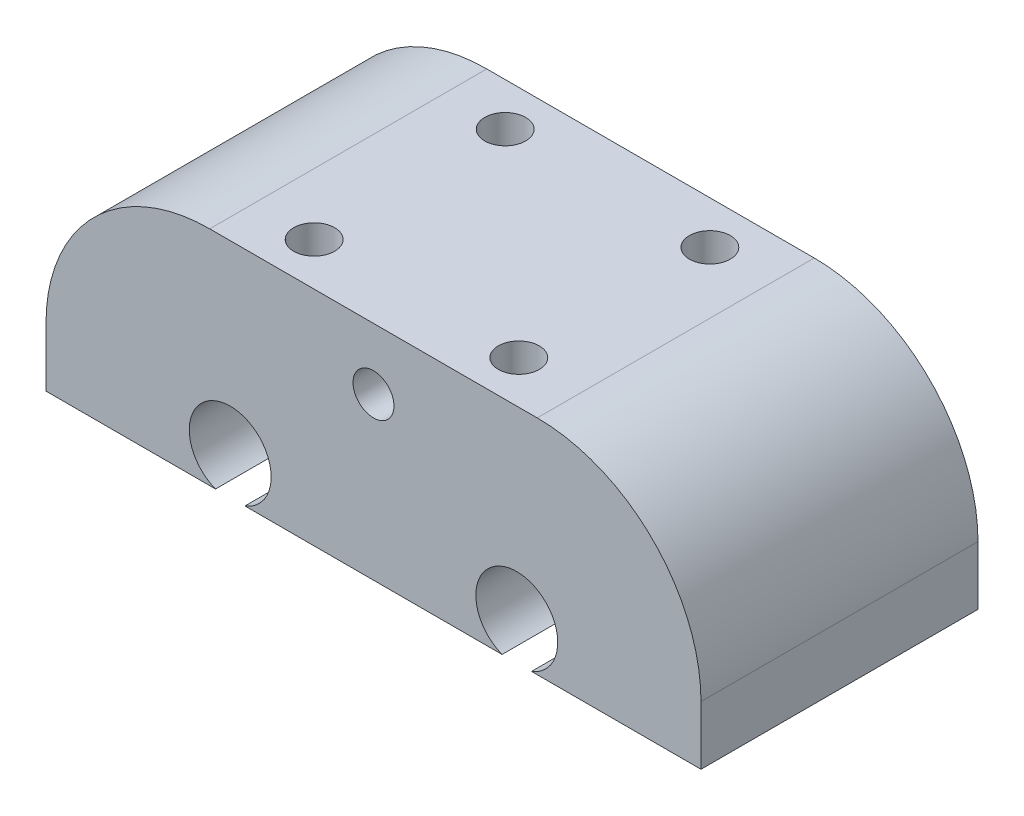
ISO-10303-21;
HEADER;
FILE_DESCRIPTION(('STEP AP214'),'2;1');
FILE_NAME('part.step','',(''),(''),'','','');
FILE_SCHEMA(('AUTOMOTIVE_DESIGN { 1 0 10303 214 1 1 1 1 }'));
ENDSEC;
DATA;
#1=APPLICATION_CONTEXT('core data for automotive mechanical design processes');
#2=APPLICATION_PROTOCOL_DEFINITION('international standard','automotive_design',2000,#1);
#3=PRODUCT_CONTEXT('',#1,'mechanical');
#4=PRODUCT('Part','Part','',(#3));
#5=PRODUCT_RELATED_PRODUCT_CATEGORY('part','',(#4));
#6=PRODUCT_DEFINITION_FORMATION('','',#4);
#7=PRODUCT_DEFINITION_CONTEXT('part definition',#1,'design');
#8=PRODUCT_DEFINITION('design','',#6,#7);
#9=PRODUCT_DEFINITION_SHAPE('','',#8);
#10=(LENGTH_UNIT() NAMED_UNIT(*) SI_UNIT(.MILLI.,.METRE.));
#11=(NAMED_UNIT(*) PLANE_ANGLE_UNIT() SI_UNIT($,.RADIAN.));
#12=(NAMED_UNIT(*) SI_UNIT($,.STERADIAN.) SOLID_ANGLE_UNIT());
#13=UNCERTAINTY_MEASURE_WITH_UNIT(LENGTH_MEASURE(1.E-05),#10,'distance_accuracy_value','');
#14=(GEOMETRIC_REPRESENTATION_CONTEXT(3) GLOBAL_UNCERTAINTY_ASSIGNED_CONTEXT((#13)) GLOBAL_UNIT_ASSIGNED_CONTEXT((#10,
#11,#12)) REPRESENTATION_CONTEXT('',''));
#15=CARTESIAN_POINT('',(0.,0.,0.));
#16=DIRECTION('',(0.,0.,1.));
#17=DIRECTION('',(1.,0.,0.));
#18=AXIS2_PLACEMENT_3D('',#15,#16,#17);
#19=CARTESIAN_POINT('',(0.,0.,0.));
#20=DIRECTION('',(0.,1.,0.));
#21=DIRECTION('',(0.,0.,1.));
#22=AXIS2_PLACEMENT_3D('',#19,#20,#21);
#23=PLANE('',#22);
#24=DIRECTION('',(1.,0.,0.));
#25=VECTOR('',#24,1.);
#26=CARTESIAN_POINT('',(0.,0.,6.8));
#27=LINE('',#26,#25);
#28=CARTESIAN_POINT('',(24.5,0.,6.8));
#29=VERTEX_POINT('',#28);
#30=CARTESIAN_POINT('',(33.4229670385731,0.,6.8));
#31=VERTEX_POINT('',#30);
#32=EDGE_CURVE('E228',#29,#31,#27,.T.);
#33=ORIENTED_EDGE('',*,*,#32,.F.);
#34=DIRECTION('',(0.,0.,1.));
#35=VECTOR('',#34,1.);
#36=CARTESIAN_POINT('',(24.5,0.,0.));
#37=LINE('',#36,#35);
#38=CARTESIAN_POINT('',(24.5,0.,13.8));
#39=VERTEX_POINT('',#38);
#40=EDGE_CURVE('E200',#29,#39,#37,.T.);
#41=ORIENTED_EDGE('',*,*,#40,.T.);
#42=DIRECTION('',(1.,0.,0.));
#43=VECTOR('',#42,1.);
#44=CARTESIAN_POINT('',(0.,0.,13.8));
#45=LINE('',#44,#43);
#46=CARTESIAN_POINT('',(33.4229670385731,0.,13.8));
#47=VERTEX_POINT('',#46);
#48=EDGE_CURVE('E223',#39,#47,#45,.T.);
#49=ORIENTED_EDGE('',*,*,#48,.T.);
#50=DIRECTION('',(0.,0.,1.));
#51=VECTOR('',#50,1.);
#52=CARTESIAN_POINT('',(33.4229670385731,0.,0.));
#53=LINE('',#52,#51);
#54=CARTESIAN_POINT('',(33.4229670385731,0.,20.3));
#55=VERTEX_POINT('',#54);
#56=EDGE_CURVE('E315',#47,#55,#53,.T.);
#57=ORIENTED_EDGE('',*,*,#56,.T.);
#58=DIRECTION('',(1.,0.,0.));
#59=VECTOR('',#58,1.);
#60=CARTESIAN_POINT('',(0.,0.,20.3));
#61=LINE('',#60,#59);
#62=CARTESIAN_POINT('',(14.5770329614269,0.,20.3));
#63=VERTEX_POINT('',#62);
#64=EDGE_CURVE('E289',#63,#55,#61,.T.);
#65=ORIENTED_EDGE('',*,*,#64,.F.);
#66=DIRECTION('',(0.,0.,1.));
#67=VECTOR('',#66,1.);
#68=CARTESIAN_POINT('',(14.5770329614269,0.,0.));
#69=LINE('',#68,#67);
#70=CARTESIAN_POINT('',(14.5770329614269,0.,13.8));
#71=VERTEX_POINT('',#70);
#72=EDGE_CURVE('E304',#63,#71,#69,.F.);
#73=ORIENTED_EDGE('',*,*,#72,.T.);
#74=DIRECTION('',(1.,0.,0.));
#75=VECTOR('',#74,1.);
#76=CARTESIAN_POINT('',(0.,0.,13.8));
#77=LINE('',#76,#75);
#78=CARTESIAN_POINT('',(23.4955030352237,0.,13.8));
#79=VERTEX_POINT('',#78);
#80=EDGE_CURVE('E254',#71,#79,#77,.T.);
#81=ORIENTED_EDGE('',*,*,#80,.T.);
#82=DIRECTION('',(0.,0.,-1.));
#83=VECTOR('',#82,1.);
#84=CARTESIAN_POINT('',(23.4955030352237,0.,0.));
#85=LINE('',#84,#83);
#86=CARTESIAN_POINT('',(23.4955030352237,0.,6.8));
#87=VERTEX_POINT('',#86);
#88=EDGE_CURVE('E327',#79,#87,#85,.T.);
#89=ORIENTED_EDGE('',*,*,#88,.T.);
#90=DIRECTION('',(1.,0.,0.));
#91=VECTOR('',#90,1.);
#92=CARTESIAN_POINT('',(0.,0.,6.8));
#93=LINE('',#92,#91);
#94=CARTESIAN_POINT('',(14.5770329614269,0.,6.8));
#95=VERTEX_POINT('',#94);
#96=EDGE_CURVE('E259',#95,#87,#93,.T.);
#97=ORIENTED_EDGE('',*,*,#96,.F.);
#98=CARTESIAN_POINT('',(14.5770329614269,0.,0.));
#99=VERTEX_POINT('',#98);
#100=EDGE_CURVE('E303',#95,#99,#69,.F.);
#101=ORIENTED_EDGE('',*,*,#100,.T.);
#102=DIRECTION('',(-1.,0.,0.));
#103=VECTOR('',#102,1.);
#104=CARTESIAN_POINT('',(0.,0.,0.));
#105=LINE('',#104,#103);
#106=CARTESIAN_POINT('',(33.4229670385731,0.,0.));
#107=VERTEX_POINT('',#106);
#108=EDGE_CURVE('E295',#107,#99,#105,.T.);
#109=ORIENTED_EDGE('',*,*,#108,.F.);
#110=EDGE_CURVE('E316',#107,#31,#53,.T.);
#111=ORIENTED_EDGE('',*,*,#110,.T.);
#112=EDGE_LOOP('',(#33,#41,#49,#57,#65,#73,#81,#89,#97,#101,#109,#111));
#113=FACE_BOUND('',#112,.T.);
#114=ADVANCED_FACE('F33',(#113),#23,.F.);
#115=DIRECTION('',(1.,0.,0.));
#116=VECTOR('',#115,1.);
#117=CARTESIAN_POINT('',(0.,0.,6.8));
#118=LINE('',#117,#116);
#119=CARTESIAN_POINT('',(35.5770329614269,0.,6.8));
#120=VERTEX_POINT('',#119);
#121=CARTESIAN_POINT('',(44.4955030352237,0.,6.8));
#122=VERTEX_POINT('',#121);
#123=EDGE_CURVE('E226',#120,#122,#118,.T.);
#124=ORIENTED_EDGE('',*,*,#123,.F.);
#125=DIRECTION('',(0.,0.,1.));
#126=VECTOR('',#125,1.);
#127=CARTESIAN_POINT('',(35.5770329614269,0.,0.));
#128=LINE('',#127,#126);
#129=CARTESIAN_POINT('',(35.5770329614269,0.,0.));
#130=VERTEX_POINT('',#129);
#131=EDGE_CURVE('E311',#120,#130,#128,.F.);
#132=ORIENTED_EDGE('',*,*,#131,.T.);
#133=CARTESIAN_POINT('',(48.,0.,0.));
#134=VERTEX_POINT('',#133);
#135=EDGE_CURVE('E278',#134,#130,#105,.T.);
#136=ORIENTED_EDGE('',*,*,#135,.F.);
#137=DIRECTION('',(0.,0.,-1.));
#138=VECTOR('',#137,1.);
#139=CARTESIAN_POINT('',(48.,0.,0.));
#140=LINE('',#139,#138);
#141=CARTESIAN_POINT('',(48.,0.,20.3));
#142=VERTEX_POINT('',#141);
#143=EDGE_CURVE('E288',#142,#134,#140,.T.);
#144=ORIENTED_EDGE('',*,*,#143,.F.);
#145=CARTESIAN_POINT('',(35.5770329614269,0.,20.3));
#146=VERTEX_POINT('',#145);
#147=EDGE_CURVE('E284',#146,#142,#61,.T.);
#148=ORIENTED_EDGE('',*,*,#147,.F.);
#149=CARTESIAN_POINT('',(35.5770329614269,0.,13.8));
#150=VERTEX_POINT('',#149);
#151=EDGE_CURVE('E312',#146,#150,#128,.F.);
#152=ORIENTED_EDGE('',*,*,#151,.T.);
#153=DIRECTION('',(1.,0.,0.));
#154=VECTOR('',#153,1.);
#155=CARTESIAN_POINT('',(0.,0.,13.8));
#156=LINE('',#155,#154);
#157=CARTESIAN_POINT('',(44.4955030352237,0.,13.8));
#158=VERTEX_POINT('',#157);
#159=EDGE_CURVE('E219',#150,#158,#156,.T.);
#160=ORIENTED_EDGE('',*,*,#159,.T.);
#161=DIRECTION('',(0.,0.,-1.));
#162=VECTOR('',#161,1.);
#163=CARTESIAN_POINT('',(44.4955030352237,0.,0.));
#164=LINE('',#163,#162);
#165=EDGE_CURVE('E335',#158,#122,#164,.T.);
#166=ORIENTED_EDGE('',*,*,#165,.T.);
#167=EDGE_LOOP('',(#124,#132,#136,#144,#148,#152,#160,#166));
#168=FACE_BOUND('',#167,.T.);
#169=ADVANCED_FACE('F368',(#168),#23,.F.);
#170=CARTESIAN_POINT('',(34.5,2.8,0.));
#171=DIRECTION('',(0.,0.,1.));
#172=DIRECTION('',(1.,0.,0.));
#173=AXIS2_PLACEMENT_3D('',#170,#171,#172);
#174=CYLINDRICAL_SURFACE('',#173,3.);
#175=CARTESIAN_POINT('',(34.5,2.8,6.8));
#176=DIRECTION('',(0.,0.,1.));
#177=DIRECTION('',(1.,0.,0.));
#178=AXIS2_PLACEMENT_3D('',#175,#176,#177);
#179=CIRCLE('',#178,3.);
#180=EDGE_CURVE('E333',#31,#120,#179,.F.);
#181=ORIENTED_EDGE('',*,*,#180,.F.);
#182=ORIENTED_EDGE('',*,*,#110,.F.);
#183=CARTESIAN_POINT('',(34.5,2.8,0.));
#184=DIRECTION('',(0.,0.,1.));
#185=DIRECTION('',(1.,0.,0.));
#186=AXIS2_PLACEMENT_3D('',#183,#184,#185);
#187=CIRCLE('',#186,3.);
#188=EDGE_CURVE('E262',#130,#107,#187,.T.);
#189=ORIENTED_EDGE('',*,*,#188,.F.);
#190=ORIENTED_EDGE('',*,*,#131,.F.);
#191=EDGE_LOOP('',(#181,#182,#189,#190));
#192=FACE_BOUND('',#191,.T.);
#193=ADVANCED_FACE('F405',(#192),#174,.F.);
#194=DIRECTION('',(1.,0.,0.));
#195=VECTOR('',#194,1.);
#196=CARTESIAN_POINT('',(0.,0.,6.8));
#197=LINE('',#196,#195);
#198=CARTESIAN_POINT('',(3.5,0.,6.8));
#199=VERTEX_POINT('',#198);
#200=CARTESIAN_POINT('',(12.4229670385731,0.,6.8));
#201=VERTEX_POINT('',#200);
#202=EDGE_CURVE('E257',#199,#201,#197,.T.);
#203=ORIENTED_EDGE('',*,*,#202,.F.);
#204=DIRECTION('',(0.,0.,1.));
#205=VECTOR('',#204,1.);
#206=CARTESIAN_POINT('',(3.5,0.,0.));
#207=LINE('',#206,#205);
#208=CARTESIAN_POINT('',(3.5,0.,13.8));
#209=VERTEX_POINT('',#208);
#210=EDGE_CURVE('E324',#199,#209,#207,.T.);
#211=ORIENTED_EDGE('',*,*,#210,.T.);
#212=DIRECTION('',(1.,0.,0.));
#213=VECTOR('',#212,1.);
#214=CARTESIAN_POINT('',(0.,0.,13.8));
#215=LINE('',#214,#213);
#216=CARTESIAN_POINT('',(12.4229670385731,0.,13.8));
#217=VERTEX_POINT('',#216);
#218=EDGE_CURVE('E250',#209,#217,#215,.T.);
#219=ORIENTED_EDGE('',*,*,#218,.T.);
#220=DIRECTION('',(0.,0.,1.));
#221=VECTOR('',#220,1.);
#222=CARTESIAN_POINT('',(12.4229670385731,0.,0.));
#223=LINE('',#222,#221);
#224=CARTESIAN_POINT('',(12.4229670385731,0.,20.3));
#225=VERTEX_POINT('',#224);
#226=EDGE_CURVE('E307',#217,#225,#223,.T.);
#227=ORIENTED_EDGE('',*,*,#226,.T.);
#228=CARTESIAN_POINT('',(0.,0.,20.3));
#229=VERTEX_POINT('',#228);
#230=EDGE_CURVE('E285',#229,#225,#61,.T.);
#231=ORIENTED_EDGE('',*,*,#230,.F.);
#232=DIRECTION('',(0.,0.,1.));
#233=VECTOR('',#232,1.);
#234=CARTESIAN_POINT('',(0.,0.,0.));
#235=LINE('',#234,#233);
#236=CARTESIAN_POINT('',(0.,0.,0.));
#237=VERTEX_POINT('',#236);
#238=EDGE_CURVE('E271',#237,#229,#235,.T.);
#239=ORIENTED_EDGE('',*,*,#238,.F.);
#240=CARTESIAN_POINT('',(12.4229670385731,0.,0.));
#241=VERTEX_POINT('',#240);
#242=EDGE_CURVE('E292',#241,#237,#105,.T.);
#243=ORIENTED_EDGE('',*,*,#242,.F.);
#244=EDGE_CURVE('E308',#241,#201,#223,.T.);
#245=ORIENTED_EDGE('',*,*,#244,.T.);
#246=EDGE_LOOP('',(#203,#211,#219,#227,#231,#239,#243,#245));
#247=FACE_BOUND('',#246,.T.);
#248=ADVANCED_FACE('F386',(#247),#23,.F.);
#249=CARTESIAN_POINT('',(13.5,2.8,0.));
#250=DIRECTION('',(0.,0.,1.));
#251=DIRECTION('',(1.,0.,0.));
#252=AXIS2_PLACEMENT_3D('',#249,#250,#251);
#253=CYLINDRICAL_SURFACE('',#252,3.);
#254=CARTESIAN_POINT('',(13.5,2.8,6.8));
#255=DIRECTION('',(0.,0.,1.));
#256=DIRECTION('',(1.,0.,0.));
#257=AXIS2_PLACEMENT_3D('',#254,#255,#256);
#258=CIRCLE('',#257,3.);
#259=EDGE_CURVE('E322',#201,#95,#258,.F.);
#260=ORIENTED_EDGE('',*,*,#259,.F.);
#261=ORIENTED_EDGE('',*,*,#244,.F.);
#262=CARTESIAN_POINT('',(13.5,2.8,0.));
#263=DIRECTION('',(0.,0.,1.));
#264=DIRECTION('',(1.,0.,0.));
#265=AXIS2_PLACEMENT_3D('',#262,#263,#264);
#266=CIRCLE('',#265,3.);
#267=EDGE_CURVE('E268',#99,#241,#266,.T.);
#268=ORIENTED_EDGE('',*,*,#267,.F.);
#269=ORIENTED_EDGE('',*,*,#100,.F.);
#270=EDGE_LOOP('',(#260,#261,#268,#269));
#271=FACE_BOUND('',#270,.T.);
#272=ADVANCED_FACE('F409',(#271),#253,.F.);
#273=CARTESIAN_POINT('',(0.,16.3,0.));
#274=DIRECTION('',(1.,0.,0.));
#275=DIRECTION('',(0.,0.,-1.));
#276=AXIS2_PLACEMENT_3D('',#273,#274,#275);
#277=PLANE('',#276);
#278=DIRECTION('',(0.,-1.,0.));
#279=VECTOR('',#278,1.);
#280=CARTESIAN_POINT('',(0.,16.3,20.3));
#281=LINE('',#280,#279);
#282=CARTESIAN_POINT('',(0.,4.3,20.3));
#283=VERTEX_POINT('',#282);
#284=EDGE_CURVE('E301',#283,#229,#281,.T.);
#285=ORIENTED_EDGE('',*,*,#284,.F.);
#286=DIRECTION('',(0.,0.,1.));
#287=VECTOR('',#286,1.);
#288=CARTESIAN_POINT('',(0.,4.3,0.));
#289=LINE('',#288,#287);
#290=CARTESIAN_POINT('',(0.,4.3,0.));
#291=VERTEX_POINT('',#290);
#292=EDGE_CURVE('E11',#283,#291,#289,.F.);
#293=ORIENTED_EDGE('',*,*,#292,.T.);
#294=DIRECTION('',(0.,-1.,0.));
#295=VECTOR('',#294,1.);
#296=CARTESIAN_POINT('',(0.,16.3,0.));
#297=LINE('',#296,#295);
#298=EDGE_CURVE('E281',#291,#237,#297,.T.);
#299=ORIENTED_EDGE('',*,*,#298,.T.);
#300=ORIENTED_EDGE('',*,*,#238,.T.);
#301=EDGE_LOOP('',(#285,#293,#299,#300));
#302=FACE_BOUND('',#301,.T.);
#303=ADVANCED_FACE('F388',(#302),#277,.F.);
#304=CARTESIAN_POINT('',(0.,16.3,20.3));
#305=DIRECTION('',(0.,0.,-1.));
#306=DIRECTION('',(-1.,0.,0.));
#307=AXIS2_PLACEMENT_3D('',#304,#305,#306);
#308=PLANE('',#307);
#309=CARTESIAN_POINT('',(24.,11.8,20.3));
#310=DIRECTION('',(0.,0.,-1.));
#311=DIRECTION('',(-1.,0.,0.));
#312=AXIS2_PLACEMENT_3D('',#309,#310,#311);
#313=CIRCLE('',#312,1.5);
#314=CARTESIAN_POINT('',(22.5,11.8,20.3));
#315=VERTEX_POINT('',#314);
#316=EDGE_CURVE('E217',#315,#315,#313,.T.);
#317=ORIENTED_EDGE('',*,*,#316,.T.);
#318=EDGE_LOOP('',(#317));
#319=FACE_BOUND('',#318,.T.);
#320=DIRECTION('',(0.,-1.,0.));
#321=VECTOR('',#320,1.);
#322=CARTESIAN_POINT('',(48.,16.3,20.3));
#323=LINE('',#322,#321);
#324=CARTESIAN_POINT('',(48.,4.3,20.3));
#325=VERTEX_POINT('',#324);
#326=EDGE_CURVE('E299',#325,#142,#323,.T.);
#327=ORIENTED_EDGE('',*,*,#326,.F.);
#328=CARTESIAN_POINT('',(36.,4.3,20.3));
#329=DIRECTION('',(0.,0.,-1.));
#330=DIRECTION('',(-1.,0.,0.));
#331=AXIS2_PLACEMENT_3D('',#328,#329,#330);
#332=CIRCLE('',#331,12.);
#333=CARTESIAN_POINT('',(36.,16.3,20.3));
#334=VERTEX_POINT('',#333);
#335=EDGE_CURVE('E41',#325,#334,#332,.F.);
#336=ORIENTED_EDGE('',*,*,#335,.T.);
#337=DIRECTION('',(1.,0.,0.));
#338=VECTOR('',#337,1.);
#339=CARTESIAN_POINT('',(0.,16.3,20.3));
#340=LINE('',#339,#338);
#341=CARTESIAN_POINT('',(12.,16.3,20.3));
#342=VERTEX_POINT('',#341);
#343=EDGE_CURVE('E274',#342,#334,#340,.T.);
#344=ORIENTED_EDGE('',*,*,#343,.F.);
#345=CARTESIAN_POINT('',(12.,4.3,20.3));
#346=DIRECTION('',(0.,0.,-1.));
#347=DIRECTION('',(-1.,0.,0.));
#348=AXIS2_PLACEMENT_3D('',#345,#346,#347);
#349=CIRCLE('',#348,12.);
#350=EDGE_CURVE('E48',#342,#283,#349,.F.);
#351=ORIENTED_EDGE('',*,*,#350,.T.);
#352=ORIENTED_EDGE('',*,*,#284,.T.);
#353=ORIENTED_EDGE('',*,*,#230,.T.);
#354=CARTESIAN_POINT('',(13.5,2.8,20.3));
#355=DIRECTION('',(0.,0.,1.));
#356=DIRECTION('',(1.,0.,0.));
#357=AXIS2_PLACEMENT_3D('',#354,#355,#356);
#358=CIRCLE('',#357,3.);
#359=EDGE_CURVE('E265',#63,#225,#358,.T.);
#360=ORIENTED_EDGE('',*,*,#359,.F.);
#361=ORIENTED_EDGE('',*,*,#64,.T.);
#362=CARTESIAN_POINT('',(34.5,2.8,20.3));
#363=DIRECTION('',(0.,0.,1.));
#364=DIRECTION('',(1.,0.,0.));
#365=AXIS2_PLACEMENT_3D('',#362,#363,#364);
#366=CIRCLE('',#365,3.);
#367=EDGE_CURVE('E261',#146,#55,#366,.T.);
#368=ORIENTED_EDGE('',*,*,#367,.F.);
#369=ORIENTED_EDGE('',*,*,#147,.T.);
#370=EDGE_LOOP('',(#327,#336,#344,#351,#352,#353,#360,#361,#368,#369));
#371=FACE_BOUND('',#370,.T.);
#372=ADVANCED_FACE('F351',(#319,#371),#308,.F.);
#373=CARTESIAN_POINT('',(48.,16.3,0.));
#374=DIRECTION('',(-1.,0.,0.));
#375=DIRECTION('',(0.,0.,1.));
#376=AXIS2_PLACEMENT_3D('',#373,#374,#375);
#377=PLANE('',#376);
#378=DIRECTION('',(0.,-1.,0.));
#379=VECTOR('',#378,1.);
#380=CARTESIAN_POINT('',(48.,16.3,0.));
#381=LINE('',#380,#379);
#382=CARTESIAN_POINT('',(48.,4.3,0.));
#383=VERTEX_POINT('',#382);
#384=EDGE_CURVE('E297',#383,#134,#381,.T.);
#385=ORIENTED_EDGE('',*,*,#384,.F.);
#386=DIRECTION('',(0.,0.,-1.));
#387=VECTOR('',#386,1.);
#388=CARTESIAN_POINT('',(48.,4.3,20.3));
#389=LINE('',#388,#387);
#390=EDGE_CURVE('E56',#383,#325,#389,.F.);
#391=ORIENTED_EDGE('',*,*,#390,.T.);
#392=ORIENTED_EDGE('',*,*,#326,.T.);
#393=ORIENTED_EDGE('',*,*,#143,.T.);
#394=EDGE_LOOP('',(#385,#391,#392,#393));
#395=FACE_BOUND('',#394,.T.);
#396=ADVANCED_FACE('F362',(#395),#377,.F.);
#397=CARTESIAN_POINT('',(0.,16.3,0.));
#398=DIRECTION('',(0.,0.,1.));
#399=DIRECTION('',(1.,0.,0.));
#400=AXIS2_PLACEMENT_3D('',#397,#398,#399);
#401=PLANE('',#400);
#402=CARTESIAN_POINT('',(24.,11.8,0.));
#403=DIRECTION('',(0.,0.,-1.));
#404=DIRECTION('',(-1.,0.,0.));
#405=AXIS2_PLACEMENT_3D('',#402,#403,#404);
#406=CIRCLE('',#405,1.5);
#407=CARTESIAN_POINT('',(22.5,11.8,0.));
#408=VERTEX_POINT('',#407);
#409=EDGE_CURVE('E212',#408,#408,#406,.T.);
#410=ORIENTED_EDGE('',*,*,#409,.F.);
#411=EDGE_LOOP('',(#410));
#412=FACE_BOUND('',#411,.T.);
#413=DIRECTION('',(-1.,0.,0.));
#414=VECTOR('',#413,1.);
#415=CARTESIAN_POINT('',(0.,16.3,0.));
#416=LINE('',#415,#414);
#417=CARTESIAN_POINT('',(36.,16.3,0.));
#418=VERTEX_POINT('',#417);
#419=CARTESIAN_POINT('',(12.,16.3,0.));
#420=VERTEX_POINT('',#419);
#421=EDGE_CURVE('E277',#418,#420,#416,.T.);
#422=ORIENTED_EDGE('',*,*,#421,.F.);
#423=CARTESIAN_POINT('',(36.,4.3,0.));
#424=DIRECTION('',(0.,0.,1.));
#425=DIRECTION('',(1.,0.,0.));
#426=AXIS2_PLACEMENT_3D('',#423,#424,#425);
#427=CIRCLE('',#426,12.);
#428=EDGE_CURVE('E347',#418,#383,#427,.F.);
#429=ORIENTED_EDGE('',*,*,#428,.T.);
#430=ORIENTED_EDGE('',*,*,#384,.T.);
#431=ORIENTED_EDGE('',*,*,#135,.T.);
#432=ORIENTED_EDGE('',*,*,#188,.T.);
#433=ORIENTED_EDGE('',*,*,#108,.T.);
#434=ORIENTED_EDGE('',*,*,#267,.T.);
#435=ORIENTED_EDGE('',*,*,#242,.T.);
#436=ORIENTED_EDGE('',*,*,#298,.F.);
#437=CARTESIAN_POINT('',(12.,4.3,0.));
#438=DIRECTION('',(0.,0.,1.));
#439=DIRECTION('',(1.,0.,0.));
#440=AXIS2_PLACEMENT_3D('',#437,#438,#439);
#441=CIRCLE('',#440,12.);
#442=EDGE_CURVE('E345',#291,#420,#441,.F.);
#443=ORIENTED_EDGE('',*,*,#442,.T.);
#444=EDGE_LOOP('',(#422,#429,#430,#431,#432,#433,#434,#435,#436,#443));
#445=FACE_BOUND('',#444,.T.);
#446=ADVANCED_FACE('F361',(#412,#445),#401,.F.);
#447=CARTESIAN_POINT('',(0.,16.3,0.));
#448=DIRECTION('',(0.,1.,0.));
#449=DIRECTION('',(0.,0.,1.));
#450=AXIS2_PLACEMENT_3D('',#447,#448,#449);
#451=PLANE('',#450);
#452=CARTESIAN_POINT('',(16.5,16.3,17.1500000000003));
#453=DIRECTION('',(0.,1.,0.));
#454=DIRECTION('',(0.,0.,1.));
#455=AXIS2_PLACEMENT_3D('',#452,#453,#454);
#456=CIRCLE('',#455,1.5);
#457=CARTESIAN_POINT('',(16.5,16.3,18.6500000000003));
#458=VERTEX_POINT('',#457);
#459=EDGE_CURVE('E520',#458,#458,#456,.T.);
#460=ORIENTED_EDGE('',*,*,#459,.F.);
#461=EDGE_LOOP('',(#460));
#462=FACE_BOUND('',#461,.T.);
#463=CARTESIAN_POINT('',(16.5,16.3,3.15000000000031));
#464=DIRECTION('',(0.,1.,0.));
#465=DIRECTION('',(0.,0.,1.));
#466=AXIS2_PLACEMENT_3D('',#463,#464,#465);
#467=CIRCLE('',#466,1.5);
#468=CARTESIAN_POINT('',(16.5,16.3,4.65000000000031));
#469=VERTEX_POINT('',#468);
#470=EDGE_CURVE('E531',#469,#469,#467,.T.);
#471=ORIENTED_EDGE('',*,*,#470,.F.);
#472=EDGE_LOOP('',(#471));
#473=FACE_BOUND('',#472,.T.);
#474=CARTESIAN_POINT('',(31.5,16.3,3.15));
#475=DIRECTION('',(0.,1.,0.));
#476=DIRECTION('',(0.,0.,1.));
#477=AXIS2_PLACEMENT_3D('',#474,#475,#476);
#478=CIRCLE('',#477,1.5);
#479=CARTESIAN_POINT('',(31.5,16.3,4.65));
#480=VERTEX_POINT('',#479);
#481=EDGE_CURVE('E537',#480,#480,#478,.T.);
#482=ORIENTED_EDGE('',*,*,#481,.F.);
#483=EDGE_LOOP('',(#482));
#484=FACE_BOUND('',#483,.T.);
#485=CARTESIAN_POINT('',(31.5,16.3,17.15));
#486=DIRECTION('',(0.,1.,0.));
#487=DIRECTION('',(0.,0.,1.));
#488=AXIS2_PLACEMENT_3D('',#485,#486,#487);
#489=CIRCLE('',#488,1.5);
#490=CARTESIAN_POINT('',(31.5,16.3,18.65));
#491=VERTEX_POINT('',#490);
#492=EDGE_CURVE('E519',#491,#491,#489,.T.);
#493=ORIENTED_EDGE('',*,*,#492,.F.);
#494=EDGE_LOOP('',(#493));
#495=FACE_BOUND('',#494,.T.);
#496=ORIENTED_EDGE('',*,*,#343,.T.);
#497=DIRECTION('',(0.,0.,-1.));
#498=VECTOR('',#497,1.);
#499=CARTESIAN_POINT('',(36.,16.3,0.));
#500=LINE('',#499,#498);
#501=EDGE_CURVE('E342',#334,#418,#500,.T.);
#502=ORIENTED_EDGE('',*,*,#501,.T.);
#503=ORIENTED_EDGE('',*,*,#421,.T.);
#504=DIRECTION('',(0.,0.,1.));
#505=VECTOR('',#504,1.);
#506=CARTESIAN_POINT('',(12.,16.3,20.3));
#507=LINE('',#506,#505);
#508=EDGE_CURVE('E339',#420,#342,#507,.T.);
#509=ORIENTED_EDGE('',*,*,#508,.T.);
#510=EDGE_LOOP('',(#496,#502,#503,#509));
#511=FACE_BOUND('',#510,.T.);
#512=ADVANCED_FACE('F356',(#462,#473,#484,#495,#511),#451,.T.);
#513=ORIENTED_EDGE('',*,*,#226,.F.);
#514=CARTESIAN_POINT('',(13.5,2.8,13.8));
#515=DIRECTION('',(0.,0.,1.));
#516=DIRECTION('',(1.,0.,0.));
#517=AXIS2_PLACEMENT_3D('',#514,#515,#516);
#518=CIRCLE('',#517,3.);
#519=EDGE_CURVE('E319',#217,#71,#518,.F.);
#520=ORIENTED_EDGE('',*,*,#519,.T.);
#521=ORIENTED_EDGE('',*,*,#72,.F.);
#522=ORIENTED_EDGE('',*,*,#359,.T.);
#523=EDGE_LOOP('',(#513,#520,#521,#522));
#524=FACE_BOUND('',#523,.T.);
#525=ADVANCED_FACE('F416',(#524),#253,.F.);
#526=ORIENTED_EDGE('',*,*,#56,.F.);
#527=CARTESIAN_POINT('',(34.5,2.8,13.8));
#528=DIRECTION('',(0.,0.,1.));
#529=DIRECTION('',(1.,0.,0.));
#530=AXIS2_PLACEMENT_3D('',#527,#528,#529);
#531=CIRCLE('',#530,3.);
#532=EDGE_CURVE('E330',#47,#150,#531,.F.);
#533=ORIENTED_EDGE('',*,*,#532,.T.);
#534=ORIENTED_EDGE('',*,*,#151,.F.);
#535=ORIENTED_EDGE('',*,*,#367,.T.);
#536=EDGE_LOOP('',(#526,#533,#534,#535));
#537=FACE_BOUND('',#536,.T.);
#538=ADVANCED_FACE('F418',(#537),#174,.F.);
#539=CARTESIAN_POINT('',(23.4955030352237,3.09986509105674,6.8));
#540=DIRECTION('',(1.,0.,0.));
#541=DIRECTION('',(0.,0.,-1.));
#542=AXIS2_PLACEMENT_3D('',#539,#540,#541);
#543=PLANE('',#542);
#544=DIRECTION('',(0.,1.,0.));
#545=VECTOR('',#544,1.);
#546=CARTESIAN_POINT('',(23.4955030352237,3.09986509105674,13.8));
#547=LINE('',#546,#545);
#548=CARTESIAN_POINT('',(23.4955030352237,3.09986509105674,13.8));
#549=VERTEX_POINT('',#548);
#550=EDGE_CURVE('E235',#79,#549,#547,.T.);
#551=ORIENTED_EDGE('',*,*,#550,.T.);
#552=DIRECTION('',(0.,0.,1.));
#553=VECTOR('',#552,1.);
#554=CARTESIAN_POINT('',(23.4955030352237,3.09986509105674,6.8));
#555=LINE('',#554,#553);
#556=CARTESIAN_POINT('',(23.4955030352237,3.09986509105674,6.8));
#557=VERTEX_POINT('',#556);
#558=EDGE_CURVE('E247',#557,#549,#555,.T.);
#559=ORIENTED_EDGE('',*,*,#558,.F.);
#560=DIRECTION('',(0.,1.,0.));
#561=VECTOR('',#560,1.);
#562=CARTESIAN_POINT('',(23.4955030352237,3.09986509105674,6.8));
#563=LINE('',#562,#561);
#564=EDGE_CURVE('E238',#87,#557,#563,.T.);
#565=ORIENTED_EDGE('',*,*,#564,.F.);
#566=ORIENTED_EDGE('',*,*,#88,.F.);
#567=EDGE_LOOP('',(#551,#559,#565,#566));
#568=FACE_BOUND('',#567,.T.);
#569=ADVANCED_FACE('F424',(#568),#543,.F.);
#570=CARTESIAN_POINT('',(3.5,2.8,6.8));
#571=DIRECTION('',(-1.,0.,0.));
#572=DIRECTION('',(0.,-1.,0.));
#573=AXIS2_PLACEMENT_3D('',#570,#571,#572);
#574=PLANE('',#573);
#575=DIRECTION('',(0.,-1.,0.));
#576=VECTOR('',#575,1.);
#577=CARTESIAN_POINT('',(3.5,2.8,6.8));
#578=LINE('',#577,#576);
#579=CARTESIAN_POINT('',(3.5,2.8,6.8));
#580=VERTEX_POINT('',#579);
#581=EDGE_CURVE('E234',#580,#199,#578,.T.);
#582=ORIENTED_EDGE('',*,*,#581,.F.);
#583=DIRECTION('',(0.,0.,1.));
#584=VECTOR('',#583,1.);
#585=CARTESIAN_POINT('',(3.5,2.8,6.8));
#586=LINE('',#585,#584);
#587=CARTESIAN_POINT('',(3.5,2.8,13.8));
#588=VERTEX_POINT('',#587);
#589=EDGE_CURVE('E240',#580,#588,#586,.T.);
#590=ORIENTED_EDGE('',*,*,#589,.T.);
#591=DIRECTION('',(0.,-1.,0.));
#592=VECTOR('',#591,1.);
#593=CARTESIAN_POINT('',(3.5,2.8,13.8));
#594=LINE('',#593,#592);
#595=EDGE_CURVE('E243',#588,#209,#594,.T.);
#596=ORIENTED_EDGE('',*,*,#595,.T.);
#597=ORIENTED_EDGE('',*,*,#210,.F.);
#598=EDGE_LOOP('',(#582,#590,#596,#597));
#599=FACE_BOUND('',#598,.T.);
#600=ADVANCED_FACE('F430',(#599),#574,.F.);
#601=CARTESIAN_POINT('',(13.5,2.8,6.8));
#602=DIRECTION('',(0.,0.,1.));
#603=DIRECTION('',(1.,0.,0.));
#604=AXIS2_PLACEMENT_3D('',#601,#602,#603);
#605=PLANE('',#604);
#606=ORIENTED_EDGE('',*,*,#96,.T.);
#607=ORIENTED_EDGE('',*,*,#564,.T.);
#608=CARTESIAN_POINT('',(13.5,2.8,6.8));
#609=DIRECTION('',(0.,0.,1.));
#610=DIRECTION('',(1.,0.,0.));
#611=AXIS2_PLACEMENT_3D('',#608,#609,#610);
#612=CIRCLE('',#611,10.);
#613=EDGE_CURVE('E231',#557,#580,#612,.T.);
#614=ORIENTED_EDGE('',*,*,#613,.T.);
#615=ORIENTED_EDGE('',*,*,#581,.T.);
#616=ORIENTED_EDGE('',*,*,#202,.T.);
#617=ORIENTED_EDGE('',*,*,#259,.T.);
#618=EDGE_LOOP('',(#606,#607,#614,#615,#616,#617));
#619=FACE_BOUND('',#618,.T.);
#620=ADVANCED_FACE('F455',(#619),#605,.T.);
#621=CARTESIAN_POINT('',(13.5,2.8,13.8));
#622=DIRECTION('',(0.,0.,1.));
#623=DIRECTION('',(1.,0.,0.));
#624=AXIS2_PLACEMENT_3D('',#621,#622,#623);
#625=PLANE('',#624);
#626=ORIENTED_EDGE('',*,*,#519,.F.);
#627=ORIENTED_EDGE('',*,*,#218,.F.);
#628=ORIENTED_EDGE('',*,*,#595,.F.);
#629=CARTESIAN_POINT('',(13.5,2.8,13.8));
#630=DIRECTION('',(0.,0.,1.));
#631=DIRECTION('',(1.,0.,0.));
#632=AXIS2_PLACEMENT_3D('',#629,#630,#631);
#633=CIRCLE('',#632,10.);
#634=EDGE_CURVE('E230',#549,#588,#633,.T.);
#635=ORIENTED_EDGE('',*,*,#634,.F.);
#636=ORIENTED_EDGE('',*,*,#550,.F.);
#637=ORIENTED_EDGE('',*,*,#80,.F.);
#638=EDGE_LOOP('',(#626,#627,#628,#635,#636,#637));
#639=FACE_BOUND('',#638,.T.);
#640=ADVANCED_FACE('F445',(#639),#625,.F.);
#641=CARTESIAN_POINT('',(13.5,2.8,6.8));
#642=DIRECTION('',(0.,0.,1.));
#643=DIRECTION('',(1.,0.,0.));
#644=AXIS2_PLACEMENT_3D('',#641,#642,#643);
#645=CYLINDRICAL_SURFACE('',#644,10.);
#646=ORIENTED_EDGE('',*,*,#634,.T.);
#647=ORIENTED_EDGE('',*,*,#589,.F.);
#648=ORIENTED_EDGE('',*,*,#613,.F.);
#649=ORIENTED_EDGE('',*,*,#558,.T.);
#650=EDGE_LOOP('',(#646,#647,#648,#649));
#651=FACE_BOUND('',#650,.T.);
#652=ADVANCED_FACE('F452',(#651),#645,.F.);
#653=CARTESIAN_POINT('',(24.5,2.8,6.8));
#654=DIRECTION('',(-1.,0.,0.));
#655=DIRECTION('',(0.,0.,1.));
#656=AXIS2_PLACEMENT_3D('',#653,#654,#655);
#657=PLANE('',#656);
#658=DIRECTION('',(0.,-1.,0.));
#659=VECTOR('',#658,1.);
#660=CARTESIAN_POINT('',(24.5,2.8,6.8));
#661=LINE('',#660,#659);
#662=CARTESIAN_POINT('',(24.5,2.8,6.8));
#663=VERTEX_POINT('',#662);
#664=EDGE_CURVE('E197',#663,#29,#661,.T.);
#665=ORIENTED_EDGE('',*,*,#664,.F.);
#666=DIRECTION('',(0.,0.,1.));
#667=VECTOR('',#666,1.);
#668=CARTESIAN_POINT('',(24.5,2.8,6.8));
#669=LINE('',#668,#667);
#670=CARTESIAN_POINT('',(24.5,2.8,13.8));
#671=VERTEX_POINT('',#670);
#672=EDGE_CURVE('E182',#663,#671,#669,.T.);
#673=ORIENTED_EDGE('',*,*,#672,.T.);
#674=DIRECTION('',(0.,-1.,0.));
#675=VECTOR('',#674,1.);
#676=CARTESIAN_POINT('',(24.5,2.8,13.8));
#677=LINE('',#676,#675);
#678=EDGE_CURVE('E209',#671,#39,#677,.T.);
#679=ORIENTED_EDGE('',*,*,#678,.T.);
#680=ORIENTED_EDGE('',*,*,#40,.F.);
#681=EDGE_LOOP('',(#665,#673,#679,#680));
#682=FACE_BOUND('',#681,.T.);
#683=ADVANCED_FACE('F198',(#682),#657,.F.);
#684=CARTESIAN_POINT('',(44.4955030352237,3.09986509105674,6.8));
#685=DIRECTION('',(1.,0.,0.));
#686=DIRECTION('',(0.,0.,-1.));
#687=AXIS2_PLACEMENT_3D('',#684,#685,#686);
#688=PLANE('',#687);
#689=DIRECTION('',(0.,1.,0.));
#690=VECTOR('',#689,1.);
#691=CARTESIAN_POINT('',(44.4955030352237,3.09986509105674,13.8));
#692=LINE('',#691,#690);
#693=CARTESIAN_POINT('',(44.4955030352237,3.09986509105674,13.8));
#694=VERTEX_POINT('',#693);
#695=EDGE_CURVE('E207',#158,#694,#692,.T.);
#696=ORIENTED_EDGE('',*,*,#695,.T.);
#697=DIRECTION('',(0.,0.,1.));
#698=VECTOR('',#697,1.);
#699=CARTESIAN_POINT('',(44.4955030352237,3.09986509105674,6.8));
#700=LINE('',#699,#698);
#701=CARTESIAN_POINT('',(44.4955030352237,3.09986509105674,6.8));
#702=VERTEX_POINT('',#701);
#703=EDGE_CURVE('E193',#702,#694,#700,.T.);
#704=ORIENTED_EDGE('',*,*,#703,.F.);
#705=DIRECTION('',(0.,1.,0.));
#706=VECTOR('',#705,1.);
#707=CARTESIAN_POINT('',(44.4955030352237,3.09986509105674,6.8));
#708=LINE('',#707,#706);
#709=EDGE_CURVE('E194',#122,#702,#708,.T.);
#710=ORIENTED_EDGE('',*,*,#709,.F.);
#711=ORIENTED_EDGE('',*,*,#165,.F.);
#712=EDGE_LOOP('',(#696,#704,#710,#711));
#713=FACE_BOUND('',#712,.T.);
#714=ADVANCED_FACE('F470',(#713),#688,.F.);
#715=CARTESIAN_POINT('',(34.5,2.8,6.8));
#716=DIRECTION('',(0.,0.,1.));
#717=DIRECTION('',(1.,0.,0.));
#718=AXIS2_PLACEMENT_3D('',#715,#716,#717);
#719=PLANE('',#718);
#720=ORIENTED_EDGE('',*,*,#32,.T.);
#721=ORIENTED_EDGE('',*,*,#180,.T.);
#722=ORIENTED_EDGE('',*,*,#123,.T.);
#723=ORIENTED_EDGE('',*,*,#709,.T.);
#724=CARTESIAN_POINT('',(34.5,2.8,6.8));
#725=DIRECTION('',(0.,0.,1.));
#726=DIRECTION('',(1.,0.,0.));
#727=AXIS2_PLACEMENT_3D('',#724,#725,#726);
#728=CIRCLE('',#727,10.);
#729=EDGE_CURVE('E187',#702,#663,#728,.T.);
#730=ORIENTED_EDGE('',*,*,#729,.T.);
#731=ORIENTED_EDGE('',*,*,#664,.T.);
#732=EDGE_LOOP('',(#720,#721,#722,#723,#730,#731));
#733=FACE_BOUND('',#732,.T.);
#734=ADVANCED_FACE('F204',(#733),#719,.T.);
#735=CARTESIAN_POINT('',(34.5,2.8,13.8));
#736=DIRECTION('',(0.,0.,1.));
#737=DIRECTION('',(1.,0.,0.));
#738=AXIS2_PLACEMENT_3D('',#735,#736,#737);
#739=PLANE('',#738);
#740=ORIENTED_EDGE('',*,*,#678,.F.);
#741=CARTESIAN_POINT('',(34.5,2.8,13.8));
#742=DIRECTION('',(0.,0.,1.));
#743=DIRECTION('',(1.,0.,0.));
#744=AXIS2_PLACEMENT_3D('',#741,#742,#743);
#745=CIRCLE('',#744,10.);
#746=EDGE_CURVE('E189',#694,#671,#745,.T.);
#747=ORIENTED_EDGE('',*,*,#746,.F.);
#748=ORIENTED_EDGE('',*,*,#695,.F.);
#749=ORIENTED_EDGE('',*,*,#159,.F.);
#750=ORIENTED_EDGE('',*,*,#532,.F.);
#751=ORIENTED_EDGE('',*,*,#48,.F.);
#752=EDGE_LOOP('',(#740,#747,#748,#749,#750,#751));
#753=FACE_BOUND('',#752,.T.);
#754=ADVANCED_FACE('F439',(#753),#739,.F.);
#755=CARTESIAN_POINT('',(34.5,2.8,6.8));
#756=DIRECTION('',(0.,0.,1.));
#757=DIRECTION('',(1.,0.,0.));
#758=AXIS2_PLACEMENT_3D('',#755,#756,#757);
#759=CYLINDRICAL_SURFACE('',#758,10.);
#760=ORIENTED_EDGE('',*,*,#746,.T.);
#761=ORIENTED_EDGE('',*,*,#672,.F.);
#762=ORIENTED_EDGE('',*,*,#729,.F.);
#763=ORIENTED_EDGE('',*,*,#703,.T.);
#764=EDGE_LOOP('',(#760,#761,#762,#763));
#765=FACE_BOUND('',#764,.T.);
#766=ADVANCED_FACE('F184',(#765),#759,.F.);
#767=CARTESIAN_POINT('',(36.,4.3,0.));
#768=DIRECTION('',(0.,0.,1.));
#769=DIRECTION('',(1.,0.,0.));
#770=AXIS2_PLACEMENT_3D('',#767,#768,#769);
#771=CYLINDRICAL_SURFACE('',#770,12.);
#772=ORIENTED_EDGE('',*,*,#335,.F.);
#773=ORIENTED_EDGE('',*,*,#390,.F.);
#774=ORIENTED_EDGE('',*,*,#428,.F.);
#775=ORIENTED_EDGE('',*,*,#501,.F.);
#776=EDGE_LOOP('',(#772,#773,#774,#775));
#777=FACE_BOUND('',#776,.T.);
#778=ADVANCED_FACE('F359',(#777),#771,.T.);
#779=CARTESIAN_POINT('',(12.,4.3,0.));
#780=DIRECTION('',(0.,0.,-1.));
#781=DIRECTION('',(-1.,0.,0.));
#782=AXIS2_PLACEMENT_3D('',#779,#780,#781);
#783=CYLINDRICAL_SURFACE('',#782,12.);
#784=ORIENTED_EDGE('',*,*,#442,.F.);
#785=ORIENTED_EDGE('',*,*,#292,.F.);
#786=ORIENTED_EDGE('',*,*,#350,.F.);
#787=ORIENTED_EDGE('',*,*,#508,.F.);
#788=EDGE_LOOP('',(#784,#785,#786,#787));
#789=FACE_BOUND('',#788,.T.);
#790=ADVANCED_FACE('F35',(#789),#783,.T.);
#791=CARTESIAN_POINT('',(24.,11.8,20.3));
#792=DIRECTION('',(0.,0.,-1.));
#793=DIRECTION('',(-1.,0.,0.));
#794=AXIS2_PLACEMENT_3D('',#791,#792,#793);
#795=CYLINDRICAL_SURFACE('',#794,1.5);
#796=ORIENTED_EDGE('',*,*,#316,.F.);
#797=EDGE_LOOP('',(#796));
#798=FACE_BOUND('',#797,.T.);
#799=ORIENTED_EDGE('',*,*,#409,.T.);
#800=EDGE_LOOP('',(#799));
#801=FACE_BOUND('',#800,.T.);
#802=ADVANCED_FACE('F392',(#798,#801),#795,.F.);
#803=CARTESIAN_POINT('',(31.5,8.3,17.15));
#804=DIRECTION('',(0.,1.,0.));
#805=DIRECTION('',(0.,0.,1.));
#806=AXIS2_PLACEMENT_3D('',#803,#804,#805);
#807=CYLINDRICAL_SURFACE('',#806,1.5);
#808=CARTESIAN_POINT('',(31.5,8.3,17.15));
#809=DIRECTION('',(0.,1.,0.));
#810=DIRECTION('',(0.,0.,1.));
#811=AXIS2_PLACEMENT_3D('',#808,#809,#810);
#812=CIRCLE('',#811,1.5);
#813=CARTESIAN_POINT('',(31.5,8.3,18.65));
#814=VERTEX_POINT('',#813);
#815=EDGE_CURVE('E523',#814,#814,#812,.T.);
#816=ORIENTED_EDGE('',*,*,#815,.F.);
#817=EDGE_LOOP('',(#816));
#818=FACE_BOUND('',#817,.T.);
#819=ORIENTED_EDGE('',*,*,#492,.T.);
#820=EDGE_LOOP('',(#819));
#821=FACE_BOUND('',#820,.T.);
#822=ADVANCED_FACE('F397',(#818,#821),#807,.F.);
#823=CARTESIAN_POINT('',(31.5,8.3,17.15));
#824=DIRECTION('',(0.,1.,0.));
#825=DIRECTION('',(0.,0.,1.));
#826=AXIS2_PLACEMENT_3D('',#823,#824,#825);
#827=PLANE('',#826);
#828=ORIENTED_EDGE('',*,*,#815,.T.);
#829=EDGE_LOOP('',(#828));
#830=FACE_BOUND('',#829,.T.);
#831=ADVANCED_FACE('F486',(#830),#827,.T.);
#832=CARTESIAN_POINT('',(31.5,8.3,3.15));
#833=DIRECTION('',(0.,1.,0.));
#834=DIRECTION('',(0.,0.,1.));
#835=AXIS2_PLACEMENT_3D('',#832,#833,#834);
#836=CYLINDRICAL_SURFACE('',#835,1.5);
#837=CARTESIAN_POINT('',(31.5,8.3,3.15));
#838=DIRECTION('',(0.,1.,0.));
#839=DIRECTION('',(0.,0.,1.));
#840=AXIS2_PLACEMENT_3D('',#837,#838,#839);
#841=CIRCLE('',#840,1.5);
#842=CARTESIAN_POINT('',(31.5,8.3,4.65));
#843=VERTEX_POINT('',#842);
#844=EDGE_CURVE('E534',#843,#843,#841,.T.);
#845=ORIENTED_EDGE('',*,*,#844,.F.);
#846=EDGE_LOOP('',(#845));
#847=FACE_BOUND('',#846,.T.);
#848=ORIENTED_EDGE('',*,*,#481,.T.);
#849=EDGE_LOOP('',(#848));
#850=FACE_BOUND('',#849,.T.);
#851=ADVANCED_FACE('F490',(#847,#850),#836,.F.);
#852=CARTESIAN_POINT('',(31.5,8.3,3.15));
#853=DIRECTION('',(0.,1.,0.));
#854=DIRECTION('',(0.,0.,1.));
#855=AXIS2_PLACEMENT_3D('',#852,#853,#854);
#856=PLANE('',#855);
#857=ORIENTED_EDGE('',*,*,#844,.T.);
#858=EDGE_LOOP('',(#857));
#859=FACE_BOUND('',#858,.T.);
#860=ADVANCED_FACE('F494',(#859),#856,.T.);
#861=CARTESIAN_POINT('',(16.5,8.3,3.15000000000031));
#862=DIRECTION('',(0.,1.,0.));
#863=DIRECTION('',(0.,0.,1.));
#864=AXIS2_PLACEMENT_3D('',#861,#862,#863);
#865=CYLINDRICAL_SURFACE('',#864,1.5);
#866=CARTESIAN_POINT('',(16.5,8.3,3.15000000000031));
#867=DIRECTION('',(0.,1.,0.));
#868=DIRECTION('',(0.,0.,1.));
#869=AXIS2_PLACEMENT_3D('',#866,#867,#868);
#870=CIRCLE('',#869,1.5);
#871=CARTESIAN_POINT('',(16.5,8.3,4.65000000000031));
#872=VERTEX_POINT('',#871);
#873=EDGE_CURVE('E526',#872,#872,#870,.T.);
#874=ORIENTED_EDGE('',*,*,#873,.F.);
#875=EDGE_LOOP('',(#874));
#876=FACE_BOUND('',#875,.T.);
#877=ORIENTED_EDGE('',*,*,#470,.T.);
#878=EDGE_LOOP('',(#877));
#879=FACE_BOUND('',#878,.T.);
#880=ADVANCED_FACE('F498',(#876,#879),#865,.F.);
#881=CARTESIAN_POINT('',(16.5,8.3,3.15000000000031));
#882=DIRECTION('',(0.,1.,0.));
#883=DIRECTION('',(0.,0.,1.));
#884=AXIS2_PLACEMENT_3D('',#881,#882,#883);
#885=PLANE('',#884);
#886=ORIENTED_EDGE('',*,*,#873,.T.);
#887=EDGE_LOOP('',(#886));
#888=FACE_BOUND('',#887,.T.);
#889=ADVANCED_FACE('F502',(#888),#885,.T.);
#890=CARTESIAN_POINT('',(16.5,8.3,17.1500000000003));
#891=DIRECTION('',(0.,1.,0.));
#892=DIRECTION('',(0.,0.,1.));
#893=AXIS2_PLACEMENT_3D('',#890,#891,#892);
#894=CYLINDRICAL_SURFACE('',#893,1.5);
#895=CARTESIAN_POINT('',(16.5,8.3,17.1500000000003));
#896=DIRECTION('',(0.,1.,0.));
#897=DIRECTION('',(0.,0.,1.));
#898=AXIS2_PLACEMENT_3D('',#895,#896,#897);
#899=CIRCLE('',#898,1.5);
#900=CARTESIAN_POINT('',(16.5,8.3,18.6500000000003));
#901=VERTEX_POINT('',#900);
#902=EDGE_CURVE('E518',#901,#901,#899,.T.);
#903=ORIENTED_EDGE('',*,*,#902,.F.);
#904=EDGE_LOOP('',(#903));
#905=FACE_BOUND('',#904,.T.);
#906=ORIENTED_EDGE('',*,*,#459,.T.);
#907=EDGE_LOOP('',(#906));
#908=FACE_BOUND('',#907,.T.);
#909=ADVANCED_FACE('F506',(#905,#908),#894,.F.);
#910=CARTESIAN_POINT('',(16.5,8.3,17.1500000000003));
#911=DIRECTION('',(0.,1.,0.));
#912=DIRECTION('',(0.,0.,1.));
#913=AXIS2_PLACEMENT_3D('',#910,#911,#912);
#914=PLANE('',#913);
#915=ORIENTED_EDGE('',*,*,#902,.T.);
#916=EDGE_LOOP('',(#915));
#917=FACE_BOUND('',#916,.T.);
#918=ADVANCED_FACE('F510',(#917),#914,.T.);
#919=CLOSED_SHELL('',(#114,#169,#193,#248,#272,#303,#372,#396,#446,#512,#525,#538,#569,#600,
#620,#640,#652,#683,#714,#734,#754,#766,#778,#790,#802,#822,#831,#851,#860,#880,#889,#909,#918));
#920=MANIFOLD_SOLID_BREP('B2',#919);
#921=ADVANCED_BREP_SHAPE_REPRESENTATION('',(#18,#920),#14);
#922=SHAPE_DEFINITION_REPRESENTATION(#9,#921);
ENDSEC;
END-ISO-10303-21;
